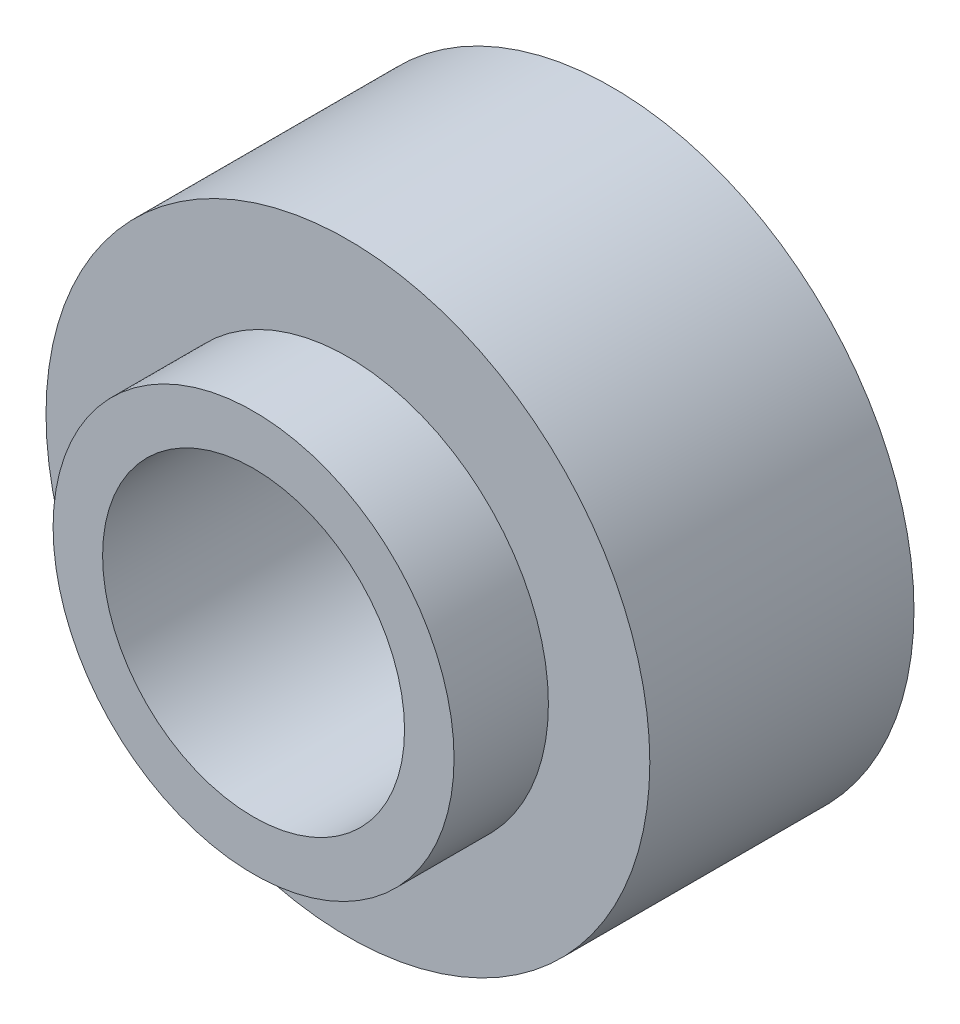
ISO-10303-21;
HEADER;
FILE_DESCRIPTION(('STEP AP214'),'2;1');
FILE_NAME('part.step','',(''),(''),'','','');
FILE_SCHEMA(('AUTOMOTIVE_DESIGN { 1 0 10303 214 1 1 1 1 }'));
ENDSEC;
DATA;
#1=APPLICATION_CONTEXT('core data for automotive mechanical design processes');
#2=APPLICATION_PROTOCOL_DEFINITION('international standard','automotive_design',2000,#1);
#3=PRODUCT_CONTEXT('',#1,'mechanical');
#4=PRODUCT('Part','Part','',(#3));
#5=PRODUCT_RELATED_PRODUCT_CATEGORY('part','',(#4));
#6=PRODUCT_DEFINITION_FORMATION('','',#4);
#7=PRODUCT_DEFINITION_CONTEXT('part definition',#1,'design');
#8=PRODUCT_DEFINITION('design','',#6,#7);
#9=PRODUCT_DEFINITION_SHAPE('','',#8);
#10=(LENGTH_UNIT() NAMED_UNIT(*) SI_UNIT(.MILLI.,.METRE.));
#11=(NAMED_UNIT(*) PLANE_ANGLE_UNIT() SI_UNIT($,.RADIAN.));
#12=(NAMED_UNIT(*) SI_UNIT($,.STERADIAN.) SOLID_ANGLE_UNIT());
#13=UNCERTAINTY_MEASURE_WITH_UNIT(LENGTH_MEASURE(1.E-05),#10,'distance_accuracy_value','');
#14=(GEOMETRIC_REPRESENTATION_CONTEXT(3) GLOBAL_UNCERTAINTY_ASSIGNED_CONTEXT((#13)) GLOBAL_UNIT_ASSIGNED_CONTEXT((#10,
#11,#12)) REPRESENTATION_CONTEXT('',''));
#15=CARTESIAN_POINT('',(0.,0.,0.));
#16=DIRECTION('',(0.,0.,1.));
#17=DIRECTION('',(1.,0.,0.));
#18=AXIS2_PLACEMENT_3D('',#15,#16,#17);
#19=CARTESIAN_POINT('',(0.,0.,7.6));
#20=DIRECTION('',(0.,0.,-1.));
#21=DIRECTION('',(-1.,0.,0.));
#22=AXIS2_PLACEMENT_3D('',#19,#20,#21);
#23=PLANE('',#22);
#24=CARTESIAN_POINT('',(0.,0.,7.6));
#25=DIRECTION('',(0.,0.,-1.));
#26=DIRECTION('',(0.,1.,0.));
#27=AXIS2_PLACEMENT_3D('',#24,#25,#26);
#28=CIRCLE('',#27,3.2005);
#29=CARTESIAN_POINT('',(0.,3.2005,7.6));
#30=VERTEX_POINT('',#29);
#31=EDGE_CURVE('E33',#30,#30,#28,.T.);
#32=ORIENTED_EDGE('',*,*,#31,.T.);
#33=EDGE_LOOP('',(#32));
#34=FACE_BOUND('',#33,.T.);
#35=CARTESIAN_POINT('',(0.,0.,7.6));
#36=DIRECTION('',(0.,0.,1.));
#37=DIRECTION('',(1.,0.,0.));
#38=AXIS2_PLACEMENT_3D('',#35,#36,#37);
#39=CIRCLE('',#38,4.25);
#40=CARTESIAN_POINT('',(4.25,0.,7.6));
#41=VERTEX_POINT('',#40);
#42=EDGE_CURVE('E17',#41,#41,#39,.F.);
#43=ORIENTED_EDGE('',*,*,#42,.F.);
#44=EDGE_LOOP('',(#43));
#45=FACE_BOUND('',#44,.T.);
#46=ADVANCED_FACE('F13',(#34,#45),#23,.F.);
#47=CARTESIAN_POINT('',(0.,0.,0.));
#48=DIRECTION('',(0.,0.,1.));
#49=DIRECTION('',(1.,0.,0.));
#50=AXIS2_PLACEMENT_3D('',#47,#48,#49);
#51=CYLINDRICAL_SURFACE('',#50,4.25);
#52=ORIENTED_EDGE('',*,*,#42,.T.);
#53=EDGE_LOOP('',(#52));
#54=FACE_BOUND('',#53,.T.);
#55=CARTESIAN_POINT('',(0.,0.,5.6));
#56=DIRECTION('',(0.,0.,1.));
#57=DIRECTION('',(1.,0.,0.));
#58=AXIS2_PLACEMENT_3D('',#55,#56,#57);
#59=CIRCLE('',#58,4.25);
#60=CARTESIAN_POINT('',(4.25,0.,5.6));
#61=VERTEX_POINT('',#60);
#62=EDGE_CURVE('E31',#61,#61,#59,.T.);
#63=ORIENTED_EDGE('',*,*,#62,.T.);
#64=EDGE_LOOP('',(#63));
#65=FACE_BOUND('',#64,.T.);
#66=ADVANCED_FACE('F40',(#54,#65),#51,.T.);
#67=CARTESIAN_POINT('',(0.,0.,7.6));
#68=DIRECTION('',(0.,0.,-1.));
#69=DIRECTION('',(0.,1.,0.));
#70=AXIS2_PLACEMENT_3D('',#67,#68,#69);
#71=CYLINDRICAL_SURFACE('',#70,3.2005);
#72=ORIENTED_EDGE('',*,*,#31,.F.);
#73=EDGE_LOOP('',(#72));
#74=FACE_BOUND('',#73,.T.);
#75=CARTESIAN_POINT('',(0.,0.,0.));
#76=DIRECTION('',(0.,0.,-1.));
#77=DIRECTION('',(0.,1.,0.));
#78=AXIS2_PLACEMENT_3D('',#75,#76,#77);
#79=CIRCLE('',#78,3.2005);
#80=CARTESIAN_POINT('',(0.,3.2005,0.));
#81=VERTEX_POINT('',#80);
#82=EDGE_CURVE('E26',#81,#81,#79,.F.);
#83=ORIENTED_EDGE('',*,*,#82,.F.);
#84=EDGE_LOOP('',(#83));
#85=FACE_BOUND('',#84,.T.);
#86=ADVANCED_FACE('F15',(#74,#85),#71,.F.);
#87=CARTESIAN_POINT('',(0.,0.,5.6));
#88=DIRECTION('',(0.,0.,-1.));
#89=DIRECTION('',(-1.,0.,0.));
#90=AXIS2_PLACEMENT_3D('',#87,#88,#89);
#91=PLANE('',#90);
#92=ORIENTED_EDGE('',*,*,#62,.F.);
#93=EDGE_LOOP('',(#92));
#94=FACE_BOUND('',#93,.T.);
#95=CARTESIAN_POINT('',(0.,0.,5.6));
#96=DIRECTION('',(0.,0.,1.));
#97=DIRECTION('',(1.,0.,0.));
#98=AXIS2_PLACEMENT_3D('',#95,#96,#97);
#99=CIRCLE('',#98,6.4);
#100=CARTESIAN_POINT('',(6.4,0.,5.6));
#101=VERTEX_POINT('',#100);
#102=EDGE_CURVE('E21',#101,#101,#99,.F.);
#103=ORIENTED_EDGE('',*,*,#102,.F.);
#104=EDGE_LOOP('',(#103));
#105=FACE_BOUND('',#104,.T.);
#106=ADVANCED_FACE('F56',(#94,#105),#91,.F.);
#107=CARTESIAN_POINT('',(0.,0.,0.));
#108=DIRECTION('',(0.,0.,-1.));
#109=DIRECTION('',(-1.,0.,0.));
#110=AXIS2_PLACEMENT_3D('',#107,#108,#109);
#111=PLANE('',#110);
#112=ORIENTED_EDGE('',*,*,#82,.T.);
#113=EDGE_LOOP('',(#112));
#114=FACE_BOUND('',#113,.T.);
#115=CARTESIAN_POINT('',(0.,0.,0.));
#116=DIRECTION('',(0.,0.,1.));
#117=DIRECTION('',(1.,0.,0.));
#118=AXIS2_PLACEMENT_3D('',#115,#116,#117);
#119=CIRCLE('',#118,6.4);
#120=CARTESIAN_POINT('',(6.4,0.,0.));
#121=VERTEX_POINT('',#120);
#122=EDGE_CURVE('E8',#121,#121,#119,.T.);
#123=ORIENTED_EDGE('',*,*,#122,.F.);
#124=EDGE_LOOP('',(#123));
#125=FACE_BOUND('',#124,.T.);
#126=ADVANCED_FACE('F51',(#114,#125),#111,.T.);
#127=CARTESIAN_POINT('',(0.,0.,0.));
#128=DIRECTION('',(0.,0.,1.));
#129=DIRECTION('',(1.,0.,0.));
#130=AXIS2_PLACEMENT_3D('',#127,#128,#129);
#131=CYLINDRICAL_SURFACE('',#130,6.4);
#132=ORIENTED_EDGE('',*,*,#122,.T.);
#133=EDGE_LOOP('',(#132));
#134=FACE_BOUND('',#133,.T.);
#135=ORIENTED_EDGE('',*,*,#102,.T.);
#136=EDGE_LOOP('',(#135));
#137=FACE_BOUND('',#136,.T.);
#138=ADVANCED_FACE('F49',(#134,#137),#131,.T.);
#139=CLOSED_SHELL('',(#46,#66,#86,#106,#126,#138));
#140=MANIFOLD_SOLID_BREP('B1',#139);
#141=ADVANCED_BREP_SHAPE_REPRESENTATION('',(#18,#140),#14);
#142=SHAPE_DEFINITION_REPRESENTATION(#9,#141);
ENDSEC;
END-ISO-10303-21;
